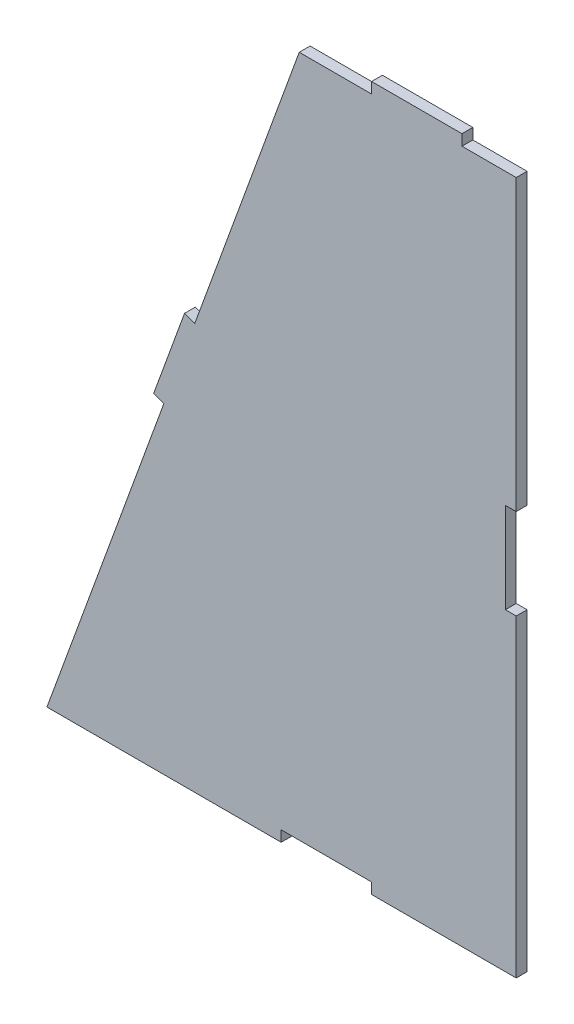
ISO-10303-21;
HEADER;
FILE_DESCRIPTION(('STEP AP214'),'2;1');
FILE_NAME('part.step','',(''),(''),'','','');
FILE_SCHEMA(('AUTOMOTIVE_DESIGN { 1 0 10303 214 1 1 1 1 }'));
ENDSEC;
DATA;
#1=APPLICATION_CONTEXT('core data for automotive mechanical design processes');
#2=APPLICATION_PROTOCOL_DEFINITION('international standard','automotive_design',2000,#1);
#3=PRODUCT_CONTEXT('',#1,'mechanical');
#4=PRODUCT('Part','Part','',(#3));
#5=PRODUCT_RELATED_PRODUCT_CATEGORY('part','',(#4));
#6=PRODUCT_DEFINITION_FORMATION('','',#4);
#7=PRODUCT_DEFINITION_CONTEXT('part definition',#1,'design');
#8=PRODUCT_DEFINITION('design','',#6,#7);
#9=PRODUCT_DEFINITION_SHAPE('','',#8);
#10=(LENGTH_UNIT() NAMED_UNIT(*) SI_UNIT(.MILLI.,.METRE.));
#11=(NAMED_UNIT(*) PLANE_ANGLE_UNIT() SI_UNIT($,.RADIAN.));
#12=(NAMED_UNIT(*) SI_UNIT($,.STERADIAN.) SOLID_ANGLE_UNIT());
#13=UNCERTAINTY_MEASURE_WITH_UNIT(LENGTH_MEASURE(1.E-05),#10,'distance_accuracy_value','');
#14=(GEOMETRIC_REPRESENTATION_CONTEXT(3) GLOBAL_UNCERTAINTY_ASSIGNED_CONTEXT((#13)) GLOBAL_UNIT_ASSIGNED_CONTEXT((#10,
#11,#12)) REPRESENTATION_CONTEXT('',''));
#15=CARTESIAN_POINT('',(0.,0.,0.));
#16=DIRECTION('',(0.,0.,1.));
#17=DIRECTION('',(1.,0.,0.));
#18=AXIS2_PLACEMENT_3D('',#15,#16,#17);
#19=CARTESIAN_POINT('',(-6.14559582837141,88.8009526642682,3.));
#20=DIRECTION('',(0.939692620785907,-0.342020143325673,0.));
#21=DIRECTION('',(0.342020143325673,0.939692620785907,0.));
#22=AXIS2_PLACEMENT_3D('',#19,#20,#21);
#23=PLANE('',#22);
#24=DIRECTION('',(-0.342020143325673,-0.939692620785907,0.));
#25=VECTOR('',#24,1.);
#26=CARTESIAN_POINT('',(-6.14559582837141,88.8009526642682,0.));
#27=LINE('',#26,#25);
#28=CARTESIAN_POINT('',(-6.14559582837141,88.8009526642682,0.));
#29=VERTEX_POINT('',#28);
#30=CARTESIAN_POINT('',(-38.4664993726475,0.,0.));
#31=VERTEX_POINT('',#30);
#32=EDGE_CURVE('E201',#29,#31,#27,.T.);
#33=ORIENTED_EDGE('',*,*,#32,.T.);
#34=DIRECTION('',(0.,0.,-1.));
#35=VECTOR('',#34,1.);
#36=CARTESIAN_POINT('',(-38.4664993726475,0.,3.));
#37=LINE('',#36,#35);
#38=CARTESIAN_POINT('',(-38.4664993726475,0.,3.));
#39=VERTEX_POINT('',#38);
#40=EDGE_CURVE('E11',#39,#31,#37,.T.);
#41=ORIENTED_EDGE('',*,*,#40,.F.);
#42=DIRECTION('',(-0.342020143325673,-0.939692620785907,0.));
#43=VECTOR('',#42,1.);
#44=CARTESIAN_POINT('',(-6.14559582837141,88.8009526642682,3.));
#45=LINE('',#44,#43);
#46=CARTESIAN_POINT('',(-6.14559582837141,88.8009526642682,3.));
#47=VERTEX_POINT('',#46);
#48=EDGE_CURVE('E239',#47,#39,#45,.T.);
#49=ORIENTED_EDGE('',*,*,#48,.F.);
#50=DIRECTION('',(0.,0.,-1.));
#51=VECTOR('',#50,1.);
#52=CARTESIAN_POINT('',(-6.14559582837141,88.8009526642682,3.));
#53=LINE('',#52,#51);
#54=EDGE_CURVE('E197',#47,#29,#53,.T.);
#55=ORIENTED_EDGE('',*,*,#54,.T.);
#56=EDGE_LOOP('',(#33,#41,#49,#55));
#57=FACE_BOUND('',#56,.T.);
#58=ADVANCED_FACE('F33',(#57),#23,.F.);
#59=CARTESIAN_POINT('',(-38.4664993726475,0.,3.));
#60=DIRECTION('',(0.,1.,0.));
#61=DIRECTION('',(-1.,0.,0.));
#62=AXIS2_PLACEMENT_3D('',#59,#60,#61);
#63=PLANE('',#62);
#64=DIRECTION('',(1.,0.,0.));
#65=VECTOR('',#64,1.);
#66=CARTESIAN_POINT('',(-38.4664993726475,0.,0.));
#67=LINE('',#66,#65);
#68=CARTESIAN_POINT('',(26.3056098657899,0.,0.));
#69=VERTEX_POINT('',#68);
#70=EDGE_CURVE('E204',#31,#69,#67,.T.);
#71=ORIENTED_EDGE('',*,*,#70,.T.);
#72=DIRECTION('',(0.,0.,-1.));
#73=VECTOR('',#72,1.);
#74=CARTESIAN_POINT('',(26.3056098657899,0.,3.));
#75=LINE('',#74,#73);
#76=CARTESIAN_POINT('',(26.3056098657899,0.,3.));
#77=VERTEX_POINT('',#76);
#78=EDGE_CURVE('E41',#77,#69,#75,.T.);
#79=ORIENTED_EDGE('',*,*,#78,.F.);
#80=DIRECTION('',(1.,0.,0.));
#81=VECTOR('',#80,1.);
#82=CARTESIAN_POINT('',(-38.4664993726475,0.,3.));
#83=LINE('',#82,#81);
#84=EDGE_CURVE('E128',#39,#77,#83,.T.);
#85=ORIENTED_EDGE('',*,*,#84,.F.);
#86=ORIENTED_EDGE('',*,*,#40,.T.);
#87=EDGE_LOOP('',(#71,#79,#85,#86));
#88=FACE_BOUND('',#87,.T.);
#89=ADVANCED_FACE('F357',(#88),#63,.F.);
#90=CARTESIAN_POINT('',(26.3056098657899,0.,3.));
#91=DIRECTION('',(-1.,0.,0.));
#92=DIRECTION('',(0.,0.,1.));
#93=AXIS2_PLACEMENT_3D('',#90,#91,#92);
#94=PLANE('',#93);
#95=DIRECTION('',(0.,1.,0.));
#96=VECTOR('',#95,1.);
#97=CARTESIAN_POINT('',(26.3056098657899,0.,0.));
#98=LINE('',#97,#96);
#99=CARTESIAN_POINT('',(26.3056098657899,2.99999999999992,0.));
#100=VERTEX_POINT('',#99);
#101=EDGE_CURVE('E206',#69,#100,#98,.T.);
#102=ORIENTED_EDGE('',*,*,#101,.T.);
#103=DIRECTION('',(0.,0.,-1.));
#104=VECTOR('',#103,1.);
#105=CARTESIAN_POINT('',(26.3056098657899,2.99999999999992,3.));
#106=LINE('',#105,#104);
#107=CARTESIAN_POINT('',(26.3056098657899,2.99999999999992,3.));
#108=VERTEX_POINT('',#107);
#109=EDGE_CURVE('E282',#108,#100,#106,.T.);
#110=ORIENTED_EDGE('',*,*,#109,.F.);
#111=DIRECTION('',(0.,1.,0.));
#112=VECTOR('',#111,1.);
#113=CARTESIAN_POINT('',(26.3056098657899,0.,3.));
#114=LINE('',#113,#112);
#115=EDGE_CURVE('E290',#77,#108,#114,.T.);
#116=ORIENTED_EDGE('',*,*,#115,.F.);
#117=ORIENTED_EDGE('',*,*,#78,.T.);
#118=EDGE_LOOP('',(#102,#110,#116,#117));
#119=FACE_BOUND('',#118,.T.);
#120=ADVANCED_FACE('F288',(#119),#94,.F.);
#121=CARTESIAN_POINT('',(26.3056098657899,2.99999999999992,3.));
#122=DIRECTION('',(0.,1.,0.));
#123=DIRECTION('',(0.,0.,1.));
#124=AXIS2_PLACEMENT_3D('',#121,#122,#123);
#125=PLANE('',#124);
#126=DIRECTION('',(1.,0.,0.));
#127=VECTOR('',#126,1.);
#128=CARTESIAN_POINT('',(26.3056098657899,2.99999999999992,0.));
#129=LINE('',#128,#127);
#130=CARTESIAN_POINT('',(51.3056098657899,2.99999999999992,0.));
#131=VERTEX_POINT('',#130);
#132=EDGE_CURVE('E208',#100,#131,#129,.T.);
#133=ORIENTED_EDGE('',*,*,#132,.T.);
#134=DIRECTION('',(0.,0.,-1.));
#135=VECTOR('',#134,1.);
#136=CARTESIAN_POINT('',(51.3056098657899,2.99999999999992,3.));
#137=LINE('',#136,#135);
#138=CARTESIAN_POINT('',(51.3056098657899,2.99999999999992,3.));
#139=VERTEX_POINT('',#138);
#140=EDGE_CURVE('E279',#139,#131,#137,.T.);
#141=ORIENTED_EDGE('',*,*,#140,.F.);
#142=DIRECTION('',(1.,0.,0.));
#143=VECTOR('',#142,1.);
#144=CARTESIAN_POINT('',(26.3056098657899,2.99999999999992,3.));
#145=LINE('',#144,#143);
#146=EDGE_CURVE('E308',#108,#139,#145,.T.);
#147=ORIENTED_EDGE('',*,*,#146,.F.);
#148=ORIENTED_EDGE('',*,*,#109,.T.);
#149=EDGE_LOOP('',(#133,#141,#147,#148));
#150=FACE_BOUND('',#149,.T.);
#151=ADVANCED_FACE('F299',(#150),#125,.F.);
#152=CARTESIAN_POINT('',(51.3056098657899,0.,3.));
#153=DIRECTION('',(1.,0.,0.));
#154=DIRECTION('',(0.,1.,0.));
#155=AXIS2_PLACEMENT_3D('',#152,#153,#154);
#156=PLANE('',#155);
#157=DIRECTION('',(0.,-1.,0.));
#158=VECTOR('',#157,1.);
#159=CARTESIAN_POINT('',(51.3056098657899,0.,0.));
#160=LINE('',#159,#158);
#161=CARTESIAN_POINT('',(51.3056098657899,0.,0.));
#162=VERTEX_POINT('',#161);
#163=EDGE_CURVE('E210',#131,#162,#160,.T.);
#164=ORIENTED_EDGE('',*,*,#163,.T.);
#165=DIRECTION('',(0.,0.,-1.));
#166=VECTOR('',#165,1.);
#167=CARTESIAN_POINT('',(51.3056098657899,0.,3.));
#168=LINE('',#167,#166);
#169=CARTESIAN_POINT('',(51.3056098657899,0.,3.));
#170=VERTEX_POINT('',#169);
#171=EDGE_CURVE('E276',#170,#162,#168,.T.);
#172=ORIENTED_EDGE('',*,*,#171,.F.);
#173=DIRECTION('',(0.,-1.,0.));
#174=VECTOR('',#173,1.);
#175=CARTESIAN_POINT('',(51.3056098657899,0.,3.));
#176=LINE('',#175,#174);
#177=EDGE_CURVE('E305',#139,#170,#176,.T.);
#178=ORIENTED_EDGE('',*,*,#177,.F.);
#179=ORIENTED_EDGE('',*,*,#140,.T.);
#180=EDGE_LOOP('',(#164,#172,#178,#179));
#181=FACE_BOUND('',#180,.T.);
#182=ADVANCED_FACE('F303',(#181),#156,.F.);
#183=CARTESIAN_POINT('',(51.3056098657899,0.,3.));
#184=DIRECTION('',(0.,1.,0.));
#185=DIRECTION('',(-1.,0.,0.));
#186=AXIS2_PLACEMENT_3D('',#183,#184,#185);
#187=PLANE('',#186);
#188=DIRECTION('',(1.,0.,0.));
#189=VECTOR('',#188,1.);
#190=CARTESIAN_POINT('',(51.3056098657899,0.,0.));
#191=LINE('',#190,#189);
#192=CARTESIAN_POINT('',(91.3056098657899,0.,0.));
#193=VERTEX_POINT('',#192);
#194=EDGE_CURVE('E212',#162,#193,#191,.T.);
#195=ORIENTED_EDGE('',*,*,#194,.T.);
#196=DIRECTION('',(0.,0.,-1.));
#197=VECTOR('',#196,1.);
#198=CARTESIAN_POINT('',(91.3056098657899,0.,3.));
#199=LINE('',#198,#197);
#200=CARTESIAN_POINT('',(91.3056098657899,0.,3.));
#201=VERTEX_POINT('',#200);
#202=EDGE_CURVE('E273',#201,#193,#199,.T.);
#203=ORIENTED_EDGE('',*,*,#202,.F.);
#204=DIRECTION('',(1.,0.,0.));
#205=VECTOR('',#204,1.);
#206=CARTESIAN_POINT('',(51.3056098657899,0.,3.));
#207=LINE('',#206,#205);
#208=EDGE_CURVE('E307',#170,#201,#207,.T.);
#209=ORIENTED_EDGE('',*,*,#208,.F.);
#210=ORIENTED_EDGE('',*,*,#171,.T.);
#211=EDGE_LOOP('',(#195,#203,#209,#210));
#212=FACE_BOUND('',#211,.T.);
#213=ADVANCED_FACE('F370',(#212),#187,.F.);
#214=CARTESIAN_POINT('',(91.3056098657899,0.,3.));
#215=DIRECTION('',(-1.,0.,0.));
#216=DIRECTION('',(0.,0.,1.));
#217=AXIS2_PLACEMENT_3D('',#214,#215,#216);
#218=PLANE('',#217);
#219=DIRECTION('',(0.,1.,0.));
#220=VECTOR('',#219,1.);
#221=CARTESIAN_POINT('',(91.3056098657899,0.,0.));
#222=LINE('',#221,#220);
#223=CARTESIAN_POINT('',(91.3056098657899,86.6972946403249,0.));
#224=VERTEX_POINT('',#223);
#225=EDGE_CURVE('E214',#193,#224,#222,.T.);
#226=ORIENTED_EDGE('',*,*,#225,.T.);
#227=DIRECTION('',(0.,0.,-1.));
#228=VECTOR('',#227,1.);
#229=CARTESIAN_POINT('',(91.3056098657899,86.6972946403249,3.));
#230=LINE('',#229,#228);
#231=CARTESIAN_POINT('',(91.3056098657899,86.6972946403249,3.));
#232=VERTEX_POINT('',#231);
#233=EDGE_CURVE('E270',#232,#224,#230,.T.);
#234=ORIENTED_EDGE('',*,*,#233,.F.);
#235=DIRECTION('',(0.,1.,0.));
#236=VECTOR('',#235,1.);
#237=CARTESIAN_POINT('',(91.3056098657899,0.,3.));
#238=LINE('',#237,#236);
#239=EDGE_CURVE('E310',#201,#232,#238,.T.);
#240=ORIENTED_EDGE('',*,*,#239,.F.);
#241=ORIENTED_EDGE('',*,*,#202,.T.);
#242=EDGE_LOOP('',(#226,#234,#240,#241));
#243=FACE_BOUND('',#242,.T.);
#244=ADVANCED_FACE('F373',(#243),#218,.F.);
#245=CARTESIAN_POINT('',(88.3056098657899,86.6972946403249,3.));
#246=DIRECTION('',(0.,-1.,0.));
#247=DIRECTION('',(0.,0.,-1.));
#248=AXIS2_PLACEMENT_3D('',#245,#246,#247);
#249=PLANE('',#248);
#250=DIRECTION('',(-1.,0.,0.));
#251=VECTOR('',#250,1.);
#252=CARTESIAN_POINT('',(88.3056098657899,86.6972946403249,0.));
#253=LINE('',#252,#251);
#254=CARTESIAN_POINT('',(88.3056098657899,86.6972946403249,0.));
#255=VERTEX_POINT('',#254);
#256=EDGE_CURVE('E216',#224,#255,#253,.T.);
#257=ORIENTED_EDGE('',*,*,#256,.T.);
#258=DIRECTION('',(0.,0.,-1.));
#259=VECTOR('',#258,1.);
#260=CARTESIAN_POINT('',(88.3056098657899,86.6972946403249,3.));
#261=LINE('',#260,#259);
#262=CARTESIAN_POINT('',(88.3056098657899,86.6972946403249,3.));
#263=VERTEX_POINT('',#262);
#264=EDGE_CURVE('E267',#263,#255,#261,.T.);
#265=ORIENTED_EDGE('',*,*,#264,.F.);
#266=DIRECTION('',(-1.,0.,0.));
#267=VECTOR('',#266,1.);
#268=CARTESIAN_POINT('',(88.3056098657899,86.6972946403249,3.));
#269=LINE('',#268,#267);
#270=EDGE_CURVE('E316',#232,#263,#269,.T.);
#271=ORIENTED_EDGE('',*,*,#270,.F.);
#272=ORIENTED_EDGE('',*,*,#233,.T.);
#273=EDGE_LOOP('',(#257,#265,#271,#272));
#274=FACE_BOUND('',#273,.T.);
#275=ADVANCED_FACE('F377',(#274),#249,.F.);
#276=CARTESIAN_POINT('',(88.3056098657899,111.697294640325,3.));
#277=DIRECTION('',(-1.,0.,0.));
#278=DIRECTION('',(0.,0.,1.));
#279=AXIS2_PLACEMENT_3D('',#276,#277,#278);
#280=PLANE('',#279);
#281=DIRECTION('',(0.,1.,0.));
#282=VECTOR('',#281,1.);
#283=CARTESIAN_POINT('',(88.3056098657899,111.697294640325,0.));
#284=LINE('',#283,#282);
#285=CARTESIAN_POINT('',(88.3056098657899,111.697294640325,0.));
#286=VERTEX_POINT('',#285);
#287=EDGE_CURVE('E218',#255,#286,#284,.T.);
#288=ORIENTED_EDGE('',*,*,#287,.T.);
#289=DIRECTION('',(0.,0.,-1.));
#290=VECTOR('',#289,1.);
#291=CARTESIAN_POINT('',(88.3056098657899,111.697294640325,3.));
#292=LINE('',#291,#290);
#293=CARTESIAN_POINT('',(88.3056098657899,111.697294640325,3.));
#294=VERTEX_POINT('',#293);
#295=EDGE_CURVE('E264',#294,#286,#292,.T.);
#296=ORIENTED_EDGE('',*,*,#295,.F.);
#297=DIRECTION('',(0.,1.,0.));
#298=VECTOR('',#297,1.);
#299=CARTESIAN_POINT('',(88.3056098657899,111.697294640325,3.));
#300=LINE('',#299,#298);
#301=EDGE_CURVE('E318',#263,#294,#300,.T.);
#302=ORIENTED_EDGE('',*,*,#301,.F.);
#303=ORIENTED_EDGE('',*,*,#264,.T.);
#304=EDGE_LOOP('',(#288,#296,#302,#303));
#305=FACE_BOUND('',#304,.T.);
#306=ADVANCED_FACE('F381',(#305),#280,.F.);
#307=CARTESIAN_POINT('',(91.3056098657899,111.697294640325,3.));
#308=DIRECTION('',(0.,1.,0.));
#309=DIRECTION('',(0.,0.,1.));
#310=AXIS2_PLACEMENT_3D('',#307,#308,#309);
#311=PLANE('',#310);
#312=DIRECTION('',(1.,0.,0.));
#313=VECTOR('',#312,1.);
#314=CARTESIAN_POINT('',(91.3056098657899,111.697294640325,0.));
#315=LINE('',#314,#313);
#316=CARTESIAN_POINT('',(91.3056098657899,111.697294640325,0.));
#317=VERTEX_POINT('',#316);
#318=EDGE_CURVE('E220',#286,#317,#315,.T.);
#319=ORIENTED_EDGE('',*,*,#318,.T.);
#320=DIRECTION('',(0.,0.,-1.));
#321=VECTOR('',#320,1.);
#322=CARTESIAN_POINT('',(91.3056098657899,111.697294640325,3.));
#323=LINE('',#322,#321);
#324=CARTESIAN_POINT('',(91.3056098657899,111.697294640325,3.));
#325=VERTEX_POINT('',#324);
#326=EDGE_CURVE('E261',#325,#317,#323,.T.);
#327=ORIENTED_EDGE('',*,*,#326,.F.);
#328=DIRECTION('',(1.,0.,0.));
#329=VECTOR('',#328,1.);
#330=CARTESIAN_POINT('',(91.3056098657899,111.697294640325,3.));
#331=LINE('',#330,#329);
#332=EDGE_CURVE('E320',#294,#325,#331,.T.);
#333=ORIENTED_EDGE('',*,*,#332,.F.);
#334=ORIENTED_EDGE('',*,*,#295,.T.);
#335=EDGE_LOOP('',(#319,#327,#333,#334));
#336=FACE_BOUND('',#335,.T.);
#337=ADVANCED_FACE('F385',(#336),#311,.F.);
#338=CARTESIAN_POINT('',(91.3056098657899,111.697294640325,3.));
#339=DIRECTION('',(-1.,0.,0.));
#340=DIRECTION('',(0.,0.,1.));
#341=AXIS2_PLACEMENT_3D('',#338,#339,#340);
#342=PLANE('',#341);
#343=DIRECTION('',(0.,1.,0.));
#344=VECTOR('',#343,1.);
#345=CARTESIAN_POINT('',(91.3056098657899,111.697294640325,0.));
#346=LINE('',#345,#344);
#347=CARTESIAN_POINT('',(91.3056098657899,191.697294640325,0.));
#348=VERTEX_POINT('',#347);
#349=EDGE_CURVE('E222',#317,#348,#346,.T.);
#350=ORIENTED_EDGE('',*,*,#349,.T.);
#351=DIRECTION('',(0.,0.,-1.));
#352=VECTOR('',#351,1.);
#353=CARTESIAN_POINT('',(91.3056098657899,191.697294640325,3.));
#354=LINE('',#353,#352);
#355=CARTESIAN_POINT('',(91.3056098657899,191.697294640325,3.));
#356=VERTEX_POINT('',#355);
#357=EDGE_CURVE('E258',#356,#348,#354,.T.);
#358=ORIENTED_EDGE('',*,*,#357,.F.);
#359=DIRECTION('',(0.,1.,0.));
#360=VECTOR('',#359,1.);
#361=CARTESIAN_POINT('',(91.3056098657899,111.697294640325,3.));
#362=LINE('',#361,#360);
#363=EDGE_CURVE('E322',#325,#356,#362,.T.);
#364=ORIENTED_EDGE('',*,*,#363,.F.);
#365=ORIENTED_EDGE('',*,*,#326,.T.);
#366=EDGE_LOOP('',(#350,#358,#364,#365));
#367=FACE_BOUND('',#366,.T.);
#368=ADVANCED_FACE('F389',(#367),#342,.F.);
#369=CARTESIAN_POINT('',(91.3056098657899,191.697294640325,3.));
#370=DIRECTION('',(0.,-1.,0.));
#371=DIRECTION('',(1.,0.,0.));
#372=AXIS2_PLACEMENT_3D('',#369,#370,#371);
#373=PLANE('',#372);
#374=DIRECTION('',(-1.,0.,0.));
#375=VECTOR('',#374,1.);
#376=CARTESIAN_POINT('',(91.3056098657899,191.697294640325,0.));
#377=LINE('',#376,#375);
#378=CARTESIAN_POINT('',(76.3056098657899,191.697294640325,0.));
#379=VERTEX_POINT('',#378);
#380=EDGE_CURVE('E224',#348,#379,#377,.T.);
#381=ORIENTED_EDGE('',*,*,#380,.T.);
#382=DIRECTION('',(0.,0.,-1.));
#383=VECTOR('',#382,1.);
#384=CARTESIAN_POINT('',(76.3056098657899,191.697294640325,3.));
#385=LINE('',#384,#383);
#386=CARTESIAN_POINT('',(76.3056098657899,191.697294640325,3.));
#387=VERTEX_POINT('',#386);
#388=EDGE_CURVE('E255',#387,#379,#385,.T.);
#389=ORIENTED_EDGE('',*,*,#388,.F.);
#390=DIRECTION('',(-1.,0.,0.));
#391=VECTOR('',#390,1.);
#392=CARTESIAN_POINT('',(91.3056098657899,191.697294640325,3.));
#393=LINE('',#392,#391);
#394=EDGE_CURVE('E324',#356,#387,#393,.T.);
#395=ORIENTED_EDGE('',*,*,#394,.F.);
#396=ORIENTED_EDGE('',*,*,#357,.T.);
#397=EDGE_LOOP('',(#381,#389,#395,#396));
#398=FACE_BOUND('',#397,.T.);
#399=ADVANCED_FACE('F393',(#398),#373,.F.);
#400=CARTESIAN_POINT('',(76.3056098657899,191.697294640325,3.));
#401=DIRECTION('',(-1.,0.,0.));
#402=DIRECTION('',(0.,0.,1.));
#403=AXIS2_PLACEMENT_3D('',#400,#401,#402);
#404=PLANE('',#403);
#405=DIRECTION('',(0.,1.,0.));
#406=VECTOR('',#405,1.);
#407=CARTESIAN_POINT('',(76.3056098657899,191.697294640325,0.));
#408=LINE('',#407,#406);
#409=CARTESIAN_POINT('',(76.3056098657899,194.697294640325,0.));
#410=VERTEX_POINT('',#409);
#411=EDGE_CURVE('E226',#379,#410,#408,.T.);
#412=ORIENTED_EDGE('',*,*,#411,.T.);
#413=DIRECTION('',(0.,0.,-1.));
#414=VECTOR('',#413,1.);
#415=CARTESIAN_POINT('',(76.3056098657899,194.697294640325,3.));
#416=LINE('',#415,#414);
#417=CARTESIAN_POINT('',(76.3056098657899,194.697294640325,3.));
#418=VERTEX_POINT('',#417);
#419=EDGE_CURVE('E252',#418,#410,#416,.T.);
#420=ORIENTED_EDGE('',*,*,#419,.F.);
#421=DIRECTION('',(0.,1.,0.));
#422=VECTOR('',#421,1.);
#423=CARTESIAN_POINT('',(76.3056098657899,191.697294640325,3.));
#424=LINE('',#423,#422);
#425=EDGE_CURVE('E326',#387,#418,#424,.T.);
#426=ORIENTED_EDGE('',*,*,#425,.F.);
#427=ORIENTED_EDGE('',*,*,#388,.T.);
#428=EDGE_LOOP('',(#412,#420,#426,#427));
#429=FACE_BOUND('',#428,.T.);
#430=ADVANCED_FACE('F397',(#429),#404,.F.);
#431=CARTESIAN_POINT('',(51.3056098657899,194.697294640325,3.));
#432=DIRECTION('',(0.,-1.,0.));
#433=DIRECTION('',(0.,0.,-1.));
#434=AXIS2_PLACEMENT_3D('',#431,#432,#433);
#435=PLANE('',#434);
#436=DIRECTION('',(-1.,0.,0.));
#437=VECTOR('',#436,1.);
#438=CARTESIAN_POINT('',(51.3056098657899,194.697294640325,0.));
#439=LINE('',#438,#437);
#440=CARTESIAN_POINT('',(51.3056098657899,194.697294640325,0.));
#441=VERTEX_POINT('',#440);
#442=EDGE_CURVE('E228',#410,#441,#439,.T.);
#443=ORIENTED_EDGE('',*,*,#442,.T.);
#444=DIRECTION('',(0.,0.,-1.));
#445=VECTOR('',#444,1.);
#446=CARTESIAN_POINT('',(51.3056098657899,194.697294640325,3.));
#447=LINE('',#446,#445);
#448=CARTESIAN_POINT('',(51.3056098657899,194.697294640325,3.));
#449=VERTEX_POINT('',#448);
#450=EDGE_CURVE('E249',#449,#441,#447,.T.);
#451=ORIENTED_EDGE('',*,*,#450,.F.);
#452=DIRECTION('',(-1.,0.,0.));
#453=VECTOR('',#452,1.);
#454=CARTESIAN_POINT('',(51.3056098657899,194.697294640325,3.));
#455=LINE('',#454,#453);
#456=EDGE_CURVE('E328',#418,#449,#455,.T.);
#457=ORIENTED_EDGE('',*,*,#456,.F.);
#458=ORIENTED_EDGE('',*,*,#419,.T.);
#459=EDGE_LOOP('',(#443,#451,#457,#458));
#460=FACE_BOUND('',#459,.T.);
#461=ADVANCED_FACE('F401',(#460),#435,.F.);
#462=CARTESIAN_POINT('',(51.3056098657899,191.697294640325,3.));
#463=DIRECTION('',(1.,0.,0.));
#464=DIRECTION('',(0.,0.,-1.));
#465=AXIS2_PLACEMENT_3D('',#462,#463,#464);
#466=PLANE('',#465);
#467=DIRECTION('',(0.,-1.,0.));
#468=VECTOR('',#467,1.);
#469=CARTESIAN_POINT('',(51.3056098657899,191.697294640325,0.));
#470=LINE('',#469,#468);
#471=CARTESIAN_POINT('',(51.3056098657899,191.697294640325,0.));
#472=VERTEX_POINT('',#471);
#473=EDGE_CURVE('E230',#441,#472,#470,.T.);
#474=ORIENTED_EDGE('',*,*,#473,.T.);
#475=DIRECTION('',(0.,0.,-1.));
#476=VECTOR('',#475,1.);
#477=CARTESIAN_POINT('',(51.3056098657899,191.697294640325,3.));
#478=LINE('',#477,#476);
#479=CARTESIAN_POINT('',(51.3056098657899,191.697294640325,3.));
#480=VERTEX_POINT('',#479);
#481=EDGE_CURVE('E246',#480,#472,#478,.T.);
#482=ORIENTED_EDGE('',*,*,#481,.F.);
#483=DIRECTION('',(0.,-1.,0.));
#484=VECTOR('',#483,1.);
#485=CARTESIAN_POINT('',(51.3056098657899,191.697294640325,3.));
#486=LINE('',#485,#484);
#487=EDGE_CURVE('E330',#449,#480,#486,.T.);
#488=ORIENTED_EDGE('',*,*,#487,.F.);
#489=ORIENTED_EDGE('',*,*,#450,.T.);
#490=EDGE_LOOP('',(#474,#482,#488,#489));
#491=FACE_BOUND('',#490,.T.);
#492=ADVANCED_FACE('F405',(#491),#466,.F.);
#493=CARTESIAN_POINT('',(51.3056098657899,191.697294640325,3.));
#494=DIRECTION('',(0.,-1.,0.));
#495=DIRECTION('',(0.,0.,-1.));
#496=AXIS2_PLACEMENT_3D('',#493,#494,#495);
#497=PLANE('',#496);
#498=DIRECTION('',(-1.,0.,0.));
#499=VECTOR('',#498,1.);
#500=CARTESIAN_POINT('',(51.3056098657899,191.697294640325,0.));
#501=LINE('',#500,#499);
#502=CARTESIAN_POINT('',(31.3056098657899,191.697294640325,0.));
#503=VERTEX_POINT('',#502);
#504=EDGE_CURVE('E232',#472,#503,#501,.T.);
#505=ORIENTED_EDGE('',*,*,#504,.T.);
#506=DIRECTION('',(0.,0.,-1.));
#507=VECTOR('',#506,1.);
#508=CARTESIAN_POINT('',(31.3056098657899,191.697294640325,3.));
#509=LINE('',#508,#507);
#510=CARTESIAN_POINT('',(31.3056098657899,191.697294640325,3.));
#511=VERTEX_POINT('',#510);
#512=EDGE_CURVE('E243',#511,#503,#509,.T.);
#513=ORIENTED_EDGE('',*,*,#512,.F.);
#514=DIRECTION('',(-1.,0.,0.));
#515=VECTOR('',#514,1.);
#516=CARTESIAN_POINT('',(51.3056098657899,191.697294640325,3.));
#517=LINE('',#516,#515);
#518=EDGE_CURVE('E332',#480,#511,#517,.T.);
#519=ORIENTED_EDGE('',*,*,#518,.F.);
#520=ORIENTED_EDGE('',*,*,#481,.T.);
#521=EDGE_LOOP('',(#505,#513,#519,#520));
#522=FACE_BOUND('',#521,.T.);
#523=ADVANCED_FACE('F338',(#522),#497,.F.);
#524=CARTESIAN_POINT('',(31.3056098657899,191.697294640325,3.));
#525=DIRECTION('',(0.939692620785907,-0.342020143325674,0.));
#526=DIRECTION('',(0.342020143325674,0.939692620785907,0.));
#527=AXIS2_PLACEMENT_3D('',#524,#525,#526);
#528=PLANE('',#527);
#529=DIRECTION('',(-0.342020143325674,-0.939692620785907,0.));
#530=VECTOR('',#529,1.);
#531=CARTESIAN_POINT('',(31.3056098657899,191.697294640325,0.));
#532=LINE('',#531,#530);
#533=CARTESIAN_POINT('',(2.40490775477049,112.293268183916,0.));
#534=VERTEX_POINT('',#533);
#535=EDGE_CURVE('E234',#503,#534,#532,.T.);
#536=ORIENTED_EDGE('',*,*,#535,.T.);
#537=DIRECTION('',(0.,0.,-1.));
#538=VECTOR('',#537,1.);
#539=CARTESIAN_POINT('',(2.40490775477049,112.293268183916,3.));
#540=LINE('',#539,#538);
#541=CARTESIAN_POINT('',(2.40490775477049,112.293268183916,3.));
#542=VERTEX_POINT('',#541);
#543=EDGE_CURVE('E192',#542,#534,#540,.T.);
#544=ORIENTED_EDGE('',*,*,#543,.F.);
#545=DIRECTION('',(-0.342020143325674,-0.939692620785907,0.));
#546=VECTOR('',#545,1.);
#547=CARTESIAN_POINT('',(31.3056098657899,191.697294640325,3.));
#548=LINE('',#547,#546);
#549=EDGE_CURVE('E183',#511,#542,#548,.T.);
#550=ORIENTED_EDGE('',*,*,#549,.F.);
#551=ORIENTED_EDGE('',*,*,#512,.T.);
#552=EDGE_LOOP('',(#536,#544,#550,#551));
#553=FACE_BOUND('',#552,.T.);
#554=ADVANCED_FACE('F342',(#553),#528,.F.);
#555=CARTESIAN_POINT('',(2.40490775477049,112.293268183916,3.));
#556=DIRECTION('',(-0.342020143325673,-0.939692620785907,0.));
#557=DIRECTION('',(0.939692620785907,-0.342020143325673,0.));
#558=AXIS2_PLACEMENT_3D('',#555,#556,#557);
#559=PLANE('',#558);
#560=DIRECTION('',(-0.939692620785907,0.342020143325673,0.));
#561=VECTOR('',#560,1.);
#562=CARTESIAN_POINT('',(2.40490775477049,112.293268183916,0.));
#563=LINE('',#562,#561);
#564=CARTESIAN_POINT('',(-0.414170107587239,113.319328613893,0.));
#565=VERTEX_POINT('',#564);
#566=EDGE_CURVE('E191',#534,#565,#563,.T.);
#567=ORIENTED_EDGE('',*,*,#566,.T.);
#568=DIRECTION('',(0.,0.,-1.));
#569=VECTOR('',#568,1.);
#570=CARTESIAN_POINT('',(-0.414170107587239,113.319328613893,3.));
#571=LINE('',#570,#569);
#572=CARTESIAN_POINT('',(-0.414170107587239,113.319328613893,3.));
#573=VERTEX_POINT('',#572);
#574=EDGE_CURVE('E188',#573,#565,#571,.T.);
#575=ORIENTED_EDGE('',*,*,#574,.F.);
#576=DIRECTION('',(-0.939692620785907,0.342020143325673,0.));
#577=VECTOR('',#576,1.);
#578=CARTESIAN_POINT('',(2.40490775477049,112.293268183916,3.));
#579=LINE('',#578,#577);
#580=EDGE_CURVE('E177',#542,#573,#579,.T.);
#581=ORIENTED_EDGE('',*,*,#580,.F.);
#582=ORIENTED_EDGE('',*,*,#543,.T.);
#583=EDGE_LOOP('',(#567,#575,#581,#582));
#584=FACE_BOUND('',#583,.T.);
#585=ADVANCED_FACE('F189',(#584),#559,.F.);
#586=CARTESIAN_POINT('',(-0.414170107587239,113.319328613893,3.));
#587=DIRECTION('',(0.939692620785907,-0.342020143325674,0.));
#588=DIRECTION('',(0.342020143325674,0.939692620785907,0.));
#589=AXIS2_PLACEMENT_3D('',#586,#587,#588);
#590=PLANE('',#589);
#591=DIRECTION('',(-0.342020143325674,-0.939692620785906,0.));
#592=VECTOR('',#591,1.);
#593=CARTESIAN_POINT('',(-0.414170107587239,113.319328613893,0.));
#594=LINE('',#593,#592);
#595=CARTESIAN_POINT('',(-8.96467369072909,89.8270130942452,0.));
#596=VERTEX_POINT('',#595);
#597=EDGE_CURVE('E114',#565,#596,#594,.T.);
#598=ORIENTED_EDGE('',*,*,#597,.T.);
#599=DIRECTION('',(0.,0.,-1.));
#600=VECTOR('',#599,1.);
#601=CARTESIAN_POINT('',(-8.96467369072909,89.8270130942452,3.));
#602=LINE('',#601,#600);
#603=CARTESIAN_POINT('',(-8.96467369072909,89.8270130942452,3.));
#604=VERTEX_POINT('',#603);
#605=EDGE_CURVE('E193',#604,#596,#602,.T.);
#606=ORIENTED_EDGE('',*,*,#605,.F.);
#607=DIRECTION('',(-0.342020143325674,-0.939692620785906,0.));
#608=VECTOR('',#607,1.);
#609=CARTESIAN_POINT('',(-0.414170107587239,113.319328613893,3.));
#610=LINE('',#609,#608);
#611=EDGE_CURVE('E181',#573,#604,#610,.T.);
#612=ORIENTED_EDGE('',*,*,#611,.F.);
#613=ORIENTED_EDGE('',*,*,#574,.T.);
#614=EDGE_LOOP('',(#598,#606,#612,#613));
#615=FACE_BOUND('',#614,.T.);
#616=ADVANCED_FACE('F195',(#615),#590,.F.);
#617=CARTESIAN_POINT('',(-8.96467369072909,89.8270130942452,3.));
#618=DIRECTION('',(0.342020143325674,0.939692620785907,0.));
#619=DIRECTION('',(-0.939692620785907,0.342020143325674,0.));
#620=AXIS2_PLACEMENT_3D('',#617,#618,#619);
#621=PLANE('',#620);
#622=DIRECTION('',(0.939692620785906,-0.342020143325674,0.));
#623=VECTOR('',#622,1.);
#624=CARTESIAN_POINT('',(-8.96467369072909,89.8270130942452,0.));
#625=LINE('',#624,#623);
#626=EDGE_CURVE('E120',#596,#29,#625,.T.);
#627=ORIENTED_EDGE('',*,*,#626,.T.);
#628=ORIENTED_EDGE('',*,*,#54,.F.);
#629=DIRECTION('',(0.939692620785906,-0.342020143325674,0.));
#630=VECTOR('',#629,1.);
#631=CARTESIAN_POINT('',(-8.96467369072909,89.8270130942452,3.));
#632=LINE('',#631,#630);
#633=EDGE_CURVE('E49',#604,#47,#632,.T.);
#634=ORIENTED_EDGE('',*,*,#633,.F.);
#635=ORIENTED_EDGE('',*,*,#605,.T.);
#636=EDGE_LOOP('',(#627,#628,#634,#635));
#637=FACE_BOUND('',#636,.T.);
#638=ADVANCED_FACE('F346',(#637),#621,.F.);
#639=CARTESIAN_POINT('',(0.,0.,3.));
#640=DIRECTION('',(0.,0.,-1.));
#641=DIRECTION('',(-1.,0.,0.));
#642=AXIS2_PLACEMENT_3D('',#639,#640,#641);
#643=PLANE('',#642);
#644=ORIENTED_EDGE('',*,*,#48,.T.);
#645=ORIENTED_EDGE('',*,*,#84,.T.);
#646=ORIENTED_EDGE('',*,*,#115,.T.);
#647=ORIENTED_EDGE('',*,*,#146,.T.);
#648=ORIENTED_EDGE('',*,*,#177,.T.);
#649=ORIENTED_EDGE('',*,*,#208,.T.);
#650=ORIENTED_EDGE('',*,*,#239,.T.);
#651=ORIENTED_EDGE('',*,*,#270,.T.);
#652=ORIENTED_EDGE('',*,*,#301,.T.);
#653=ORIENTED_EDGE('',*,*,#332,.T.);
#654=ORIENTED_EDGE('',*,*,#363,.T.);
#655=ORIENTED_EDGE('',*,*,#394,.T.);
#656=ORIENTED_EDGE('',*,*,#425,.T.);
#657=ORIENTED_EDGE('',*,*,#456,.T.);
#658=ORIENTED_EDGE('',*,*,#487,.T.);
#659=ORIENTED_EDGE('',*,*,#518,.T.);
#660=ORIENTED_EDGE('',*,*,#549,.T.);
#661=ORIENTED_EDGE('',*,*,#580,.T.);
#662=ORIENTED_EDGE('',*,*,#611,.T.);
#663=ORIENTED_EDGE('',*,*,#633,.T.);
#664=EDGE_LOOP('',(#644,#645,#646,#647,#648,#649,#650,#651,#652,#653,#654,#655,#656,#657,#658,
#659,#660,#661,#662,#663));
#665=FACE_BOUND('',#664,.T.);
#666=ADVANCED_FACE('F179',(#665),#643,.F.);
#667=CARTESIAN_POINT('',(0.,0.,0.));
#668=DIRECTION('',(0.,0.,-1.));
#669=DIRECTION('',(-1.,0.,0.));
#670=AXIS2_PLACEMENT_3D('',#667,#668,#669);
#671=PLANE('',#670);
#672=ORIENTED_EDGE('',*,*,#32,.F.);
#673=ORIENTED_EDGE('',*,*,#626,.F.);
#674=ORIENTED_EDGE('',*,*,#597,.F.);
#675=ORIENTED_EDGE('',*,*,#566,.F.);
#676=ORIENTED_EDGE('',*,*,#535,.F.);
#677=ORIENTED_EDGE('',*,*,#504,.F.);
#678=ORIENTED_EDGE('',*,*,#473,.F.);
#679=ORIENTED_EDGE('',*,*,#442,.F.);
#680=ORIENTED_EDGE('',*,*,#411,.F.);
#681=ORIENTED_EDGE('',*,*,#380,.F.);
#682=ORIENTED_EDGE('',*,*,#349,.F.);
#683=ORIENTED_EDGE('',*,*,#318,.F.);
#684=ORIENTED_EDGE('',*,*,#287,.F.);
#685=ORIENTED_EDGE('',*,*,#256,.F.);
#686=ORIENTED_EDGE('',*,*,#225,.F.);
#687=ORIENTED_EDGE('',*,*,#194,.F.);
#688=ORIENTED_EDGE('',*,*,#163,.F.);
#689=ORIENTED_EDGE('',*,*,#132,.F.);
#690=ORIENTED_EDGE('',*,*,#101,.F.);
#691=ORIENTED_EDGE('',*,*,#70,.F.);
#692=EDGE_LOOP('',(#672,#673,#674,#675,#676,#677,#678,#679,#680,#681,#682,#683,#684,#685,#686,
#687,#688,#689,#690,#691));
#693=FACE_BOUND('',#692,.T.);
#694=ADVANCED_FACE('F294',(#693),#671,.T.);
#695=CLOSED_SHELL('',(#58,#89,#120,#151,#182,#213,#244,#275,#306,#337,#368,#399,#430,#461,#492,
#523,#554,#585,#616,#638,#666,#694));
#696=MANIFOLD_SOLID_BREP('B2',#695);
#697=ADVANCED_BREP_SHAPE_REPRESENTATION('',(#18,#696),#14);
#698=SHAPE_DEFINITION_REPRESENTATION(#9,#697);
ENDSEC;
END-ISO-10303-21;
